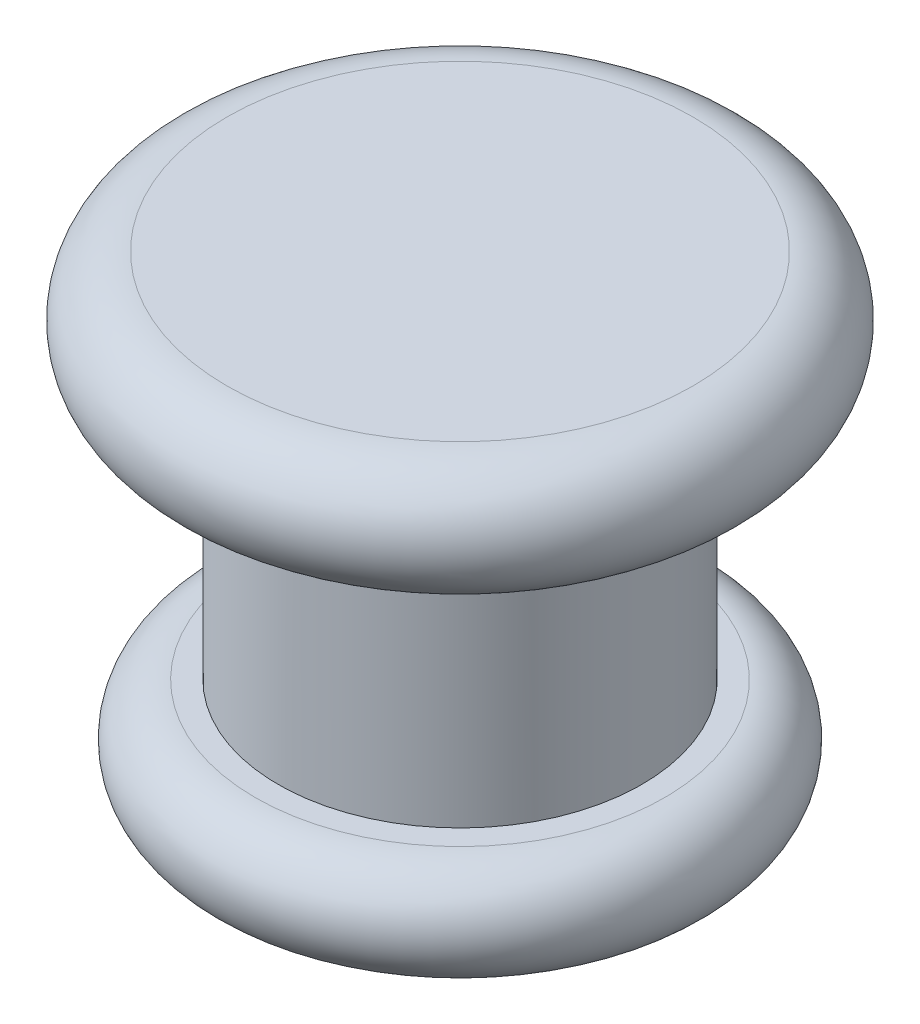
ISO-10303-21;
HEADER;
FILE_DESCRIPTION(('STEP AP214'),'2;1');
FILE_NAME('part.step','',(''),(''),'','','');
FILE_SCHEMA(('AUTOMOTIVE_DESIGN { 1 0 10303 214 1 1 1 1 }'));
ENDSEC;
DATA;
#1=APPLICATION_CONTEXT('core data for automotive mechanical design processes');
#2=APPLICATION_PROTOCOL_DEFINITION('international standard','automotive_design',2000,#1);
#3=PRODUCT_CONTEXT('',#1,'mechanical');
#4=PRODUCT('Part','Part','',(#3));
#5=PRODUCT_RELATED_PRODUCT_CATEGORY('part','',(#4));
#6=PRODUCT_DEFINITION_FORMATION('','',#4);
#7=PRODUCT_DEFINITION_CONTEXT('part definition',#1,'design');
#8=PRODUCT_DEFINITION('design','',#6,#7);
#9=PRODUCT_DEFINITION_SHAPE('','',#8);
#10=(LENGTH_UNIT() NAMED_UNIT(*) SI_UNIT(.MILLI.,.METRE.));
#11=(NAMED_UNIT(*) PLANE_ANGLE_UNIT() SI_UNIT($,.RADIAN.));
#12=(NAMED_UNIT(*) SI_UNIT($,.STERADIAN.) SOLID_ANGLE_UNIT());
#13=UNCERTAINTY_MEASURE_WITH_UNIT(LENGTH_MEASURE(1.E-05),#10,'distance_accuracy_value','');
#14=(GEOMETRIC_REPRESENTATION_CONTEXT(3) GLOBAL_UNCERTAINTY_ASSIGNED_CONTEXT((#13)) GLOBAL_UNIT_ASSIGNED_CONTEXT((#10,
#11,#12)) REPRESENTATION_CONTEXT('',''));
#15=CARTESIAN_POINT('',(0.,0.,0.));
#16=DIRECTION('',(0.,0.,1.));
#17=DIRECTION('',(1.,0.,0.));
#18=AXIS2_PLACEMENT_3D('',#15,#16,#17);
#19=CARTESIAN_POINT('',(0.,5.1562,0.));
#20=DIRECTION('',(0.,-1.,0.));
#21=DIRECTION('',(1.,0.,0.));
#22=AXIS2_PLACEMENT_3D('',#19,#20,#21);
#23=PLANE('',#22);
#24=CARTESIAN_POINT('',(0.,5.1562,0.));
#25=DIRECTION('',(0.,-1.,0.));
#26=DIRECTION('',(1.,0.,0.));
#27=AXIS2_PLACEMENT_3D('',#24,#25,#26);
#28=CIRCLE('',#27,10.1219);
#29=CARTESIAN_POINT('',(10.1219,5.1562,0.));
#30=VERTEX_POINT('',#29);
#31=EDGE_CURVE('E25',#30,#30,#28,.T.);
#32=ORIENTED_EDGE('',*,*,#31,.F.);
#33=EDGE_LOOP('',(#32));
#34=FACE_BOUND('',#33,.T.);
#35=ADVANCED_FACE('F15',(#34),#23,.F.);
#36=CARTESIAN_POINT('',(0.,2.5781,0.));
#37=DIRECTION('',(0.,-1.,0.));
#38=DIRECTION('',(1.,0.,0.));
#39=AXIS2_PLACEMENT_3D('',#36,#37,#38);
#40=TOROIDAL_SURFACE('',#39,10.1219,2.5781);
#41=CARTESIAN_POINT('',(0.,0.,0.));
#42=DIRECTION('',(0.,-1.,0.));
#43=DIRECTION('',(1.,0.,0.));
#44=AXIS2_PLACEMENT_3D('',#41,#42,#43);
#45=CIRCLE('',#44,10.1219);
#46=CARTESIAN_POINT('',(10.1219,0.,0.));
#47=VERTEX_POINT('',#46);
#48=EDGE_CURVE('E29',#47,#47,#45,.T.);
#49=ORIENTED_EDGE('',*,*,#48,.F.);
#50=EDGE_LOOP('',(#49));
#51=FACE_BOUND('',#50,.T.);
#52=ORIENTED_EDGE('',*,*,#31,.T.);
#53=EDGE_LOOP('',(#52));
#54=FACE_BOUND('',#53,.T.);
#55=ADVANCED_FACE('F58',(#51,#54),#40,.T.);
#56=CARTESIAN_POINT('',(-10.1219,0.,0.));
#57=DIRECTION('',(0.,1.,0.));
#58=DIRECTION('',(-1.,0.,0.));
#59=AXIS2_PLACEMENT_3D('',#56,#57,#58);
#60=PLANE('',#59);
#61=CARTESIAN_POINT('',(0.,0.,0.));
#62=DIRECTION('',(0.,1.,0.));
#63=DIRECTION('',(-1.,0.,0.));
#64=AXIS2_PLACEMENT_3D('',#61,#62,#63);
#65=CIRCLE('',#64,8.6614);
#66=CARTESIAN_POINT('',(-8.6614,0.,0.));
#67=VERTEX_POINT('',#66);
#68=EDGE_CURVE('E10',#67,#67,#65,.T.);
#69=ORIENTED_EDGE('',*,*,#68,.T.);
#70=EDGE_LOOP('',(#69));
#71=FACE_BOUND('',#70,.T.);
#72=ORIENTED_EDGE('',*,*,#48,.T.);
#73=EDGE_LOOP('',(#72));
#74=FACE_BOUND('',#73,.T.);
#75=ADVANCED_FACE('F64',(#71,#74),#60,.F.);
#76=CARTESIAN_POINT('',(0.,-45.2903007518797,0.));
#77=DIRECTION('',(0.,-1.,0.));
#78=DIRECTION('',(1.,0.,0.));
#79=AXIS2_PLACEMENT_3D('',#76,#77,#78);
#80=CYLINDRICAL_SURFACE('',#79,7.8994);
#81=CARTESIAN_POINT('',(0.,-10.9474,0.));
#82=DIRECTION('',(0.,-1.,0.));
#83=DIRECTION('',(0.,0.,-1.));
#84=AXIS2_PLACEMENT_3D('',#81,#82,#83);
#85=CIRCLE('',#84,7.8994);
#86=CARTESIAN_POINT('',(0.,-10.9474,-7.8994));
#87=VERTEX_POINT('',#86);
#88=EDGE_CURVE('E34',#87,#87,#85,.T.);
#89=ORIENTED_EDGE('',*,*,#88,.F.);
#90=EDGE_LOOP('',(#89));
#91=FACE_BOUND('',#90,.T.);
#92=CARTESIAN_POINT('',(0.,-0.761999999999999,0.));
#93=DIRECTION('',(0.,1.,0.));
#94=DIRECTION('',(-1.,0.,0.));
#95=AXIS2_PLACEMENT_3D('',#92,#93,#94);
#96=CIRCLE('',#95,7.8994);
#97=CARTESIAN_POINT('',(-7.8994,-0.761999999999998,0.));
#98=VERTEX_POINT('',#97);
#99=EDGE_CURVE('E21',#98,#98,#96,.F.);
#100=ORIENTED_EDGE('',*,*,#99,.T.);
#101=EDGE_LOOP('',(#100));
#102=FACE_BOUND('',#101,.T.);
#103=ADVANCED_FACE('F72',(#91,#102),#80,.T.);
#104=CARTESIAN_POINT('',(0.,-0.761999999999999,0.));
#105=DIRECTION('',(0.,1.,0.));
#106=DIRECTION('',(-1.,0.,0.));
#107=AXIS2_PLACEMENT_3D('',#104,#105,#106);
#108=TOROIDAL_SURFACE('',#107,8.6614,0.762);
#109=ORIENTED_EDGE('',*,*,#68,.F.);
#110=EDGE_LOOP('',(#109));
#111=FACE_BOUND('',#110,.T.);
#112=ORIENTED_EDGE('',*,*,#99,.F.);
#113=EDGE_LOOP('',(#112));
#114=FACE_BOUND('',#113,.T.);
#115=ADVANCED_FACE('F78',(#111,#114),#108,.F.);
#116=CARTESIAN_POINT('',(8.89,-10.9474,0.));
#117=DIRECTION('',(0.,-1.,0.));
#118=DIRECTION('',(0.,0.,-1.));
#119=AXIS2_PLACEMENT_3D('',#116,#117,#118);
#120=PLANE('',#119);
#121=CARTESIAN_POINT('',(0.,-10.9474,0.));
#122=DIRECTION('',(0.,1.,0.));
#123=DIRECTION('',(0.,0.,1.));
#124=AXIS2_PLACEMENT_3D('',#121,#122,#123);
#125=CIRCLE('',#124,8.89);
#126=CARTESIAN_POINT('',(0.,-10.9474,8.89));
#127=VERTEX_POINT('',#126);
#128=EDGE_CURVE('E37',#127,#127,#125,.T.);
#129=ORIENTED_EDGE('',*,*,#128,.T.);
#130=EDGE_LOOP('',(#129));
#131=FACE_BOUND('',#130,.T.);
#132=ORIENTED_EDGE('',*,*,#88,.T.);
#133=EDGE_LOOP('',(#132));
#134=FACE_BOUND('',#133,.T.);
#135=ADVANCED_FACE('F54',(#131,#134),#120,.F.);
#136=CARTESIAN_POINT('',(0.,-13.1699,0.));
#137=DIRECTION('',(0.,1.,0.));
#138=DIRECTION('',(0.,0.,1.));
#139=AXIS2_PLACEMENT_3D('',#136,#137,#138);
#140=TOROIDAL_SURFACE('',#139,8.89,2.2225);
#141=ORIENTED_EDGE('',*,*,#128,.F.);
#142=EDGE_LOOP('',(#141));
#143=FACE_BOUND('',#142,.T.);
#144=CARTESIAN_POINT('',(0.,-15.3924,0.));
#145=DIRECTION('',(0.,1.,0.));
#146=DIRECTION('',(0.,0.,1.));
#147=AXIS2_PLACEMENT_3D('',#144,#145,#146);
#148=CIRCLE('',#147,8.89);
#149=CARTESIAN_POINT('',(0.,-15.3924,8.89));
#150=VERTEX_POINT('',#149);
#151=EDGE_CURVE('E40',#150,#150,#148,.T.);
#152=ORIENTED_EDGE('',*,*,#151,.T.);
#153=EDGE_LOOP('',(#152));
#154=FACE_BOUND('',#153,.T.);
#155=ADVANCED_FACE('F44',(#143,#154),#140,.T.);
#156=CARTESIAN_POINT('',(0.,-15.3924,0.));
#157=DIRECTION('',(0.,1.,0.));
#158=DIRECTION('',(0.,0.,1.));
#159=AXIS2_PLACEMENT_3D('',#156,#157,#158);
#160=PLANE('',#159);
#161=ORIENTED_EDGE('',*,*,#151,.F.);
#162=EDGE_LOOP('',(#161));
#163=FACE_BOUND('',#162,.T.);
#164=ADVANCED_FACE('F46',(#163),#160,.F.);
#165=CLOSED_SHELL('',(#35,#55,#75,#103,#115,#135,#155,#164));
#166=MANIFOLD_SOLID_BREP('B1',#165);
#167=ADVANCED_BREP_SHAPE_REPRESENTATION('',(#18,#166),#14);
#168=SHAPE_DEFINITION_REPRESENTATION(#9,#167);
ENDSEC;
END-ISO-10303-21;
